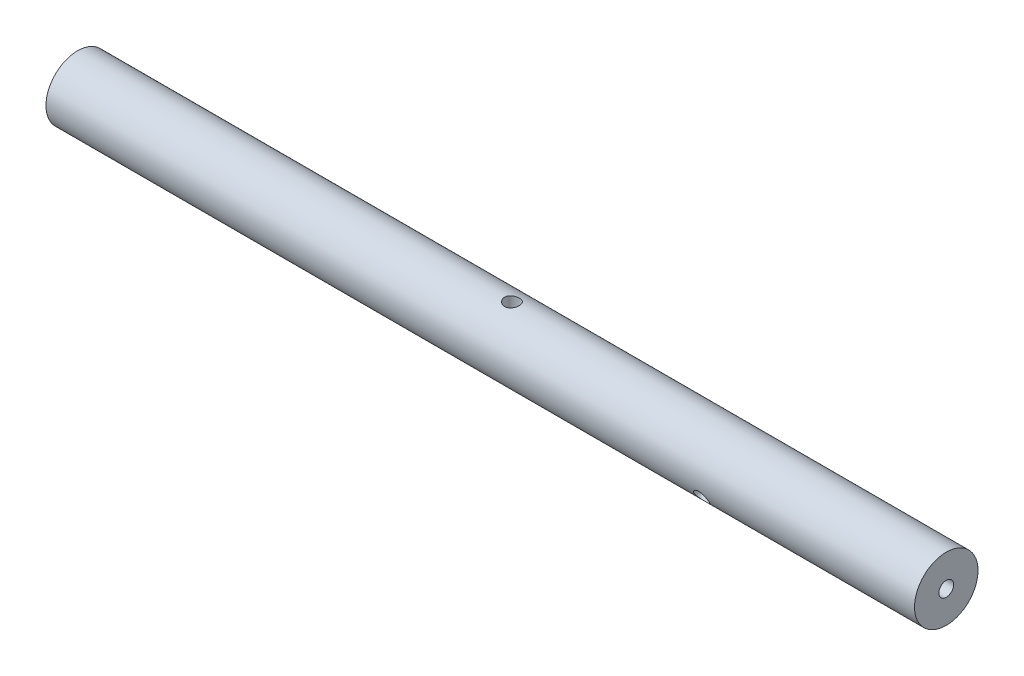
ISO-10303-21;
HEADER;
FILE_DESCRIPTION(('STEP AP214'),'2;1');
FILE_NAME('part.step','',(''),(''),'','','');
FILE_SCHEMA(('AUTOMOTIVE_DESIGN { 1 0 10303 214 1 1 1 1 }'));
ENDSEC;
DATA;
#1=APPLICATION_CONTEXT('core data for automotive mechanical design processes');
#2=APPLICATION_PROTOCOL_DEFINITION('international standard','automotive_design',2000,#1);
#3=PRODUCT_CONTEXT('',#1,'mechanical');
#4=PRODUCT('Part','Part','',(#3));
#5=PRODUCT_RELATED_PRODUCT_CATEGORY('part','',(#4));
#6=PRODUCT_DEFINITION_FORMATION('','',#4);
#7=PRODUCT_DEFINITION_CONTEXT('part definition',#1,'design');
#8=PRODUCT_DEFINITION('design','',#6,#7);
#9=PRODUCT_DEFINITION_SHAPE('','',#8);
#10=(LENGTH_UNIT() NAMED_UNIT(*) SI_UNIT(.MILLI.,.METRE.));
#11=(NAMED_UNIT(*) PLANE_ANGLE_UNIT() SI_UNIT($,.RADIAN.));
#12=(NAMED_UNIT(*) SI_UNIT($,.STERADIAN.) SOLID_ANGLE_UNIT());
#13=UNCERTAINTY_MEASURE_WITH_UNIT(LENGTH_MEASURE(1.E-05),#10,'distance_accuracy_value','');
#14=(GEOMETRIC_REPRESENTATION_CONTEXT(3) GLOBAL_UNCERTAINTY_ASSIGNED_CONTEXT((#13)) GLOBAL_UNIT_ASSIGNED_CONTEXT((#10,
#11,#12)) REPRESENTATION_CONTEXT('',''));
#15=CARTESIAN_POINT('',(0.,0.,0.));
#16=DIRECTION('',(0.,0.,1.));
#17=DIRECTION('',(1.,0.,0.));
#18=AXIS2_PLACEMENT_3D('',#15,#16,#17);
#19=CARTESIAN_POINT('',(304.,0.,0.));
#20=DIRECTION('',(-1.,0.,0.));
#21=DIRECTION('',(0.,0.,1.));
#22=AXIS2_PLACEMENT_3D('',#19,#20,#21);
#23=CYLINDRICAL_SURFACE('',#22,11.11);
#24=CARTESIAN_POINT('',(228.,-7.63729991491183,8.06868948526883));
#25=CARTESIAN_POINT('',(227.857206050793,-7.63729737460289,8.06869425359438));
#26=CARTESIAN_POINT('',(227.714358900543,-7.62842807157487,8.07711543123798));
#27=CARTESIAN_POINT('',(227.432743410383,-7.59310991494183,8.11032356623413));
#28=CARTESIAN_POINT('',(227.293977842589,-7.5666493891085,8.13512138983964));
#29=CARTESIAN_POINT('',(227.02463969806,-7.49668398538741,8.19963871520527));
#30=CARTESIAN_POINT('',(226.894057686016,-7.45319917142187,8.23934064951492));
#31=CARTESIAN_POINT('',(226.644387625805,-7.34995037812349,8.33157252437299));
#32=CARTESIAN_POINT('',(226.525299646415,-7.29018630138817,8.3841025416745));
#33=CARTESIAN_POINT('',(226.299733288068,-7.15421298381429,8.50043863853168));
#34=CARTESIAN_POINT('',(226.193505439678,-7.07773993387425,8.56442222611203));
#35=CARTESIAN_POINT('',(225.998874304842,-6.91029302069932,8.70008859999237));
#36=CARTESIAN_POINT('',(225.910472516096,-6.81931794019003,8.77177203243862));
#37=CARTESIAN_POINT('',(225.752997693792,-6.62340181090361,8.92064688780315));
#38=CARTESIAN_POINT('',(225.684167783989,-6.51830712369479,8.99789380984));
#39=CARTESIAN_POINT('',(225.569366717814,-6.29731756184636,9.15391502373882));
#40=CARTESIAN_POINT('',(225.523392663609,-6.18142405857377,9.23268912065779));
#41=CARTESIAN_POINT('',(225.456402364187,-5.94387518984704,9.38734108100553));
#42=CARTESIAN_POINT('',(225.434961479561,-5.82235697336378,9.46324551506538));
#43=CARTESIAN_POINT('',(225.416316297768,-5.57507988035985,9.6109997693072));
#44=CARTESIAN_POINT('',(225.419108890977,-5.44932154999062,9.68285010851701));
#45=CARTESIAN_POINT('',(225.448539631683,-5.19973778374768,9.81909703246836));
#46=CARTESIAN_POINT('',(225.474719813022,-5.07592148745279,9.8836100662894));
#47=CARTESIAN_POINT('',(225.549450160758,-4.83151230820271,10.0053606357911));
#48=CARTESIAN_POINT('',(225.598001418691,-4.71091958283654,10.0625978162928));
#49=CARTESIAN_POINT('',(225.716486302235,-4.47567048303367,10.1694303645679));
#50=CARTESIAN_POINT('',(225.786589080656,-4.36106977633113,10.2189604355522));
#51=CARTESIAN_POINT('',(225.946060058163,-4.14239966201978,10.3095418849164));
#52=CARTESIAN_POINT('',(226.03543118902,-4.03833186058697,10.3505919711634));
#53=CARTESIAN_POINT('',(226.233379729815,-3.84176097814323,10.4251762124415));
#54=CARTESIAN_POINT('',(226.342357790233,-3.74958566957661,10.4585119170313));
#55=CARTESIAN_POINT('',(226.575128695024,-3.58296701579384,10.5167609328243));
#56=CARTESIAN_POINT('',(226.69892205105,-3.50852428324596,10.5416739530326));
#57=CARTESIAN_POINT('',(226.958483247955,-3.37996150165802,10.5835991533192));
#58=CARTESIAN_POINT('',(227.094293584359,-3.32591744799275,10.6005818435449));
#59=CARTESIAN_POINT('',(227.373634417675,-3.2408183169185,10.6269093281547));
#60=CARTESIAN_POINT('',(227.517163510715,-3.20975907414459,10.6362555064786));
#61=CARTESIAN_POINT('',(227.804345387817,-3.17244727769871,10.6474434699306));
#62=CARTESIAN_POINT('',(227.94792006057,-3.165642901288,10.6494522157317));
#63=CARTESIAN_POINT('',(228.234167969219,-3.17560434049653,10.6464859768584));
#64=CARTESIAN_POINT('',(228.376841274749,-3.19236831242531,10.6415115384603));
#65=CARTESIAN_POINT('',(228.655228426144,-3.24833275798181,10.6245593336454));
#66=CARTESIAN_POINT('',(228.791010719891,-3.28722359193175,10.6126781699347));
#67=CARTESIAN_POINT('',(229.054008553654,-3.38561945533486,10.5816976332888));
#68=CARTESIAN_POINT('',(229.181223188372,-3.4451266591379,10.5625974989698));
#69=CARTESIAN_POINT('',(229.425882855137,-3.58369969236734,10.5163968078337));
#70=CARTESIAN_POINT('',(229.543122575351,-3.6630838791152,10.4891644815366));
#71=CARTESIAN_POINT('',(229.762322672498,-3.83803931842112,10.4264170493616));
#72=CARTESIAN_POINT('',(229.864280894622,-3.93361284976298,10.3909007771843));
#73=CARTESIAN_POINT('',(230.052242066214,-4.13994842080595,10.3104521451756));
#74=CARTESIAN_POINT('',(230.137859917599,-4.25099006329087,10.2653357281687));
#75=CARTESIAN_POINT('',(230.287938399714,-4.48295470256306,10.1661744664912));
#76=CARTESIAN_POINT('',(230.35240007783,-4.60387720980478,10.1121300640206));
#77=CARTESIAN_POINT('',(230.457819861664,-4.85080357346019,9.99601287383305));
#78=CARTESIAN_POINT('',(230.498936619729,-4.97676674668828,9.93399787918759));
#79=CARTESIAN_POINT('',(230.556987884387,-5.23049884385673,9.80277311236298));
#80=CARTESIAN_POINT('',(230.573926379692,-5.35826746643718,9.73356452893909));
#81=CARTESIAN_POINT('',(230.582942058634,-5.60865024331557,9.59142259008584));
#82=CARTESIAN_POINT('',(230.575591327805,-5.73131506466755,9.51861417610653));
#83=CARTESIAN_POINT('',(230.537529598267,-5.97110343021756,9.3700544209964));
#84=CARTESIAN_POINT('',(230.506819127578,-6.08822709960335,9.29430314642227));
#85=CARTESIAN_POINT('',(230.423198051676,-6.31347141833531,9.14278648371898));
#86=CARTESIAN_POINT('',(230.37037796021,-6.42162664447853,9.06702239804286));
#87=CARTESIAN_POINT('',(230.244121936876,-6.62706205247653,8.91797477457922));
#88=CARTESIAN_POINT('',(230.170683740723,-6.724341038258,8.84469151022727));
#89=CARTESIAN_POINT('',(230.003460819088,-6.90805108840274,8.7019973938647));
#90=CARTESIAN_POINT('',(229.909279510885,-6.99420998120042,8.63270086261733));
#91=CARTESIAN_POINT('',(229.704031497188,-7.15167821170303,8.50270830221399));
#92=CARTESIAN_POINT('',(229.592960651364,-7.22298389808235,8.44201438898656));
#93=CARTESIAN_POINT('',(229.355014841942,-7.35049272663532,8.33124353433473));
#94=CARTESIAN_POINT('',(229.227921633536,-7.4064446961468,8.28134570306007));
#95=CARTESIAN_POINT('',(228.962869847239,-7.50072195915349,8.19605646654894));
#96=CARTESIAN_POINT('',(228.824920043494,-7.53906131898824,8.16065348744158));
#97=CARTESIAN_POINT('',(228.572482223884,-7.59117294929293,8.11216106082328));
#98=CARTESIAN_POINT('',(228.459301323799,-7.60844916361104,8.09591574680687));
#99=CARTESIAN_POINT('',(228.230758439936,-7.63151331568119,8.0741783666477));
#100=CARTESIAN_POINT('',(228.115396592235,-7.63730196782091,8.0686856318246));
#101=CARTESIAN_POINT('',(228.,-7.63729991491183,8.06868948526883));
#102=B_SPLINE_CURVE_WITH_KNOTS('',3,(#24,#25,#26,#27,#28,#29,#30,#31,#32,#33,#34,#35,#36,#37,
#38,#39,#40,#41,#42,#43,#44,#45,#46,#47,#48,#49,#50,#51,#52,#53,#54,#55,#56,#57,#58,#59,#60,#61,
#62,#63,#64,#65,#66,#67,#68,#69,#70,#71,#72,#73,#74,#75,#76,#77,#78,#79,#80,#81,#82,#83,#84,#85,
#86,#87,#88,#89,#90,#91,#92,#93,#94,#95,#96,#97,#98,#99,#100,#101),.UNSPECIFIED.,.T.,.F.,(4,2,2,
2,2,2,2,2,2,2,2,2,2,2,2,2,2,2,2,2,2,2,2,2,2,2,2,2,2,2,2,2,2,2,2,2,2,2,4),(0.,0.427958589243742,
0.856201423798316,1.28394106610051,1.71168326772106,2.14674201170975,2.58183729299628,
3.02212224474731,3.46235135968424,3.89483955494707,4.32727225443571,4.75141845725171,
5.17558535730033,5.60317032170868,6.03082039115803,6.46848201566221,6.90615875937449,
7.34545034265557,7.78466229690882,8.21381559615048,8.64293532571614,9.06619273657193,
9.48949480077892,9.92006687005439,10.3506995963391,10.7904834385017,11.2302455048545,
11.666982027164,12.1036464922691,12.5301001626726,12.9565441938703,13.3812592371416,
13.8060209409947,14.2397442886435,14.6735741318884,15.1141271358033,15.5543276770175,
15.9001969139619,16.2460446413408),.UNSPECIFIED.);
#103=CARTESIAN_POINT('',(228.,-7.63729991491183,8.06868948526883));
#104=VERTEX_POINT('',#103);
#105=EDGE_CURVE('E11',#104,#104,#102,.T.);
#106=ORIENTED_EDGE('',*,*,#105,.T.);
#107=EDGE_LOOP('',(#106));
#108=FACE_BOUND('',#107,.T.);
#109=CARTESIAN_POINT('',(76.,-3.16904011203537,-10.6484404852688));
#110=CARTESIAN_POINT('',(75.8572060507933,-3.1690455116809,-10.6484406694595));
#111=CARTESIAN_POINT('',(75.7143589005434,-3.18077311696405,-10.6449702165451));
#112=CARTESIAN_POINT('',(75.4327434103829,-3.22719128379955,-10.6309878631842));
#113=CARTESIAN_POINT('',(75.2939778425891,-3.26189709191716,-10.6204712874178));
#114=CARTESIAN_POINT('',(75.0246396980597,-3.35275343652855,-10.5921381330921));
#115=CARTESIAN_POINT('',(74.8940576860156,-3.40887872720286,-10.5743301466739));
#116=CARTESIAN_POINT('',(74.6443876258045,-3.54037827051779,-10.5310300061965));
#117=CARTESIAN_POINT('',(74.5252996464148,-3.6157526383298,-10.5055378061607));
#118=CARTESIAN_POINT('',(74.2997332880682,-3.78448931237219,-10.4459495073334));
#119=CARTESIAN_POINT('',(74.1935054396783,-3.87813724961207,-10.4117136971707));
#120=CARTESIAN_POINT('',(73.9988743048423,-4.07935123241923,-10.3345336035161));
#121=CARTESIAN_POINT('',(73.9104725160956,-4.1869184462028,-10.2915885889068));
#122=CARTESIAN_POINT('',(73.7529976937924,-4.41380591757643,-10.1963576716159));
#123=CARTESIAN_POINT('',(73.6841677839891,-4.53325105802891,-10.1439664637087));
#124=CARTESIAN_POINT('',(73.5693667178144,-4.77886417371878,-10.0305944961262));
#125=CARTESIAN_POINT('',(73.5233926636093,-4.90503129444709,-9.96961482661803));
#126=CARTESIAN_POINT('',(73.4564023641869,-5.15773825521666,-9.8412174518343));
#127=CARTESIAN_POINT('',(73.4349614795613,-5.284232531614,-9.77393180636714));
#128=CARTESIAN_POINT('',(73.4163162977682,-5.5358300158066,-9.63366068917267));
#129=CARTESIAN_POINT('',(73.4191088909771,-5.66093340001743,-9.56067594994031));
#130=CARTESIAN_POINT('',(73.4485396316833,-5.90371858046826,-9.4126535299774));
#131=CARTESIAN_POINT('',(73.4747198130217,-6.02149665477992,-9.33768198889405));
#132=CARTESIAN_POINT('',(73.549450160758,-6.24914033051869,-9.18689271549623));
#133=CARTESIAN_POINT('',(73.5980014186907,-6.35900554555722,-9.11107494206836));
#134=CARTESIAN_POINT('',(73.7164863022345,-6.5691497962159,-8.9607595195592));
#135=CARTESIAN_POINT('',(73.7865890806561,-6.66934444929085,-8.88627743175531));
#136=CARTESIAN_POINT('',(73.9460600581635,-6.85712534270754,-8.74219428239535));
#137=CARTESIAN_POINT('',(74.03543118902,-6.94470966094133,-8.672593965762));
#138=CARTESIAN_POINT('',(74.2333797298153,-7.10758694983208,-8.53965070856048));
#139=CARTESIAN_POINT('',(74.3423577902326,-7.1825441711432,-8.47649240203501));
#140=CARTESIAN_POINT('',(74.5751286950235,-7.31629862545677,-8.36132092301127));
#141=CARTESIAN_POINT('',(74.6989220510502,-7.37509530011606,-8.3093081356018));
#142=CARTESIAN_POINT('',(74.9584832479553,-7.47568497941696,-8.21893210090876));
#143=CARTESIAN_POINT('',(75.0942935843588,-7.51741444740963,-8.18061992262399));
#144=CARTESIAN_POINT('',(75.3736344176745,-7.5827642834366,-8.12008565557861));
#145=CARTESIAN_POINT('',(75.5171635107147,-7.60638793268036,-8.09786065147606));
#146=CARTESIAN_POINT('',(75.8043453878175,-7.63473289146931,-8.07114166961908));
#147=CARTESIAN_POINT('',(75.9479200605705,-7.63987470456819,-8.06625327969106));
#148=CARTESIAN_POINT('',(76.2341679692192,-7.63232514674598,-8.07339701966726));
#149=CARTESIAN_POINT('',(76.3768412747495,-7.6196351707593,-8.08542782602688));
#150=CARTESIAN_POINT('',(76.6552284261438,-7.57697190796112,-8.12541835518003));
#151=CARTESIAN_POINT('',(76.7910107198912,-7.54723710138624,-8.15315822349973));
#152=CARTESIAN_POINT('',(77.054008553654,-7.47120923792642,-8.22288127251115));
#153=CARTESIAN_POINT('',(77.1812231883717,-7.42491443448897,-8.26486595555329));
#154=CARTESIAN_POINT('',(77.4258828551373,-7.31561694567799,-8.36177337704141));
#155=CARTESIAN_POINT('',(77.5431225753507,-7.25234096592657,-8.41690593627526));
#156=CARTESIAN_POINT('',(77.762322672498,-7.1105223759878,-8.53704807515694));
#157=CARTESIAN_POINT('',(77.8642808946216,-7.03197761636368,-8.60205904513976));
#158=CARTESIAN_POINT('',(78.0522420662138,-6.85913927182295,-8.740526575363));
#159=CARTESIAN_POINT('',(78.1378599175985,-6.76454648732477,-8.81413325012943));
#160=CARTESIAN_POINT('',(78.2879383997138,-6.56268799600463,-8.96543988968008));
#161=CARTESIAN_POINT('',(78.3524000778301,-6.45542291691184,-9.0431396516054));
#162=CARTESIAN_POINT('',(78.4578198616638,-6.23139929856568,-9.19892556030135));
#163=CARTESIAN_POINT('',(78.4989366197287,-6.11471115117311,-9.27700537093543));
#164=CARTESIAN_POINT('',(78.5569878843866,-5.87420112091309,-9.43113142942651));
#165=CARTESIAN_POINT('',(78.5739263796925,-5.75038041821785,-9.50717801067578));
#166=CARTESIAN_POINT('',(78.582942058634,-5.50209049978856,-9.65294488669593));
#167=CARTESIAN_POINT('',(78.575591327805,-5.37770415299724,-9.72277153114778));
#168=CARTESIAN_POINT('',(78.5375295982668,-5.12915344831687,-9.85615446969097));
#169=CARTESIAN_POINT('',(78.5068191275776,-5.00498908547372,-9.91971090547645));
#170=CARTESIAN_POINT('',(78.4231980516757,-4.76114964711006,-10.0390198762048));
#171=CARTESIAN_POINT('',(78.3703779602095,-4.64145841114844,-10.0948030067588));
#172=CARTESIAN_POINT('',(78.244121936876,-4.40966167885623,-10.1981914771901));
#173=CARTESIAN_POINT('',(78.1706837407226,-4.29755701736445,-10.2457959179553));
#174=CARTESIAN_POINT('',(78.0034608190883,-4.08212526255152,-10.3335464301298));
#175=CARTESIAN_POINT('',(77.9092795108853,-3.97903325969831,-10.3735139544309));
#176=CARTESIAN_POINT('',(77.704031497188,-3.78772228483473,-10.4448891621335));
#177=CARTESIAN_POINT('',(77.5929606513638,-3.69950697093504,-10.4762947413585));
#178=CARTESIAN_POINT('',(77.3550148419421,-3.53982218253116,-10.5313351987663));
#179=CARTESIAN_POINT('',(77.2279216335358,-3.46863340829782,-10.5548421101176));
#180=CARTESIAN_POINT('',(76.9628698472392,-3.34763213130646,-10.5938439966251));
#181=CARTESIAN_POINT('',(76.8249200434941,-3.29780257211245,-10.6093453666532));
#182=CARTESIAN_POINT('',(76.5724822238841,-3.22975108361751,-10.6302291490205));
#183=CARTESIAN_POINT('',(76.4593013237994,-3.20704412182779,-10.637068132493));
#184=CARTESIAN_POINT('',(76.2307584399355,-3.17668692236315,-10.6461735840229));
#185=CARTESIAN_POINT('',(76.1153965922354,-3.16903574840024,-10.6484403364181));
#186=CARTESIAN_POINT('',(76.,-3.16904011203537,-10.6484404852688));
#187=B_SPLINE_CURVE_WITH_KNOTS('',3,(#109,#110,#111,#112,#113,#114,#115,#116,#117,#118,#119,
#120,#121,#122,#123,#124,#125,#126,#127,#128,#129,#130,#131,#132,#133,#134,#135,#136,#137,#138,
#139,#140,#141,#142,#143,#144,#145,#146,#147,#148,#149,#150,#151,#152,#153,#154,#155,#156,#157,
#158,#159,#160,#161,#162,#163,#164,#165,#166,#167,#168,#169,#170,#171,#172,#173,#174,#175,#176,
#177,#178,#179,#180,#181,#182,#183,#184,#185,#186),.UNSPECIFIED.,.T.,.F.,(4,2,2,2,2,2,2,2,2,2,2,
2,2,2,2,2,2,2,2,2,2,2,2,2,2,2,2,2,2,2,2,2,2,2,2,2,2,2,4),(0.,0.427958589243783,
0.856201423798331,1.2839410661005,1.71168326772106,2.14674201170974,2.58183729299632,
3.02212224474733,3.46235135968427,3.89483955494709,4.32727225443574,4.75141845725173,
5.17558535730036,5.60317032170872,6.03082039115806,6.46848201566223,6.90615875937452,
7.3454503426556,7.78466229690887,8.21381559615049,8.64293532571611,9.06619273657193,
9.48949480077898,9.92006687005444,10.3506995963391,10.7904834385018,11.2302455048546,
11.6669820271641,12.1036464922691,12.5301001626727,12.9565441938703,13.3812592371416,
13.8060209409948,14.2397442886435,14.6735741318884,15.1141271358033,15.5543276770176,
15.9001969139619,16.2460446413408),.UNSPECIFIED.);
#188=CARTESIAN_POINT('',(76.,-3.16904011203537,-10.6484404852688));
#189=VERTEX_POINT('',#188);
#190=EDGE_CURVE('E50',#189,#189,#187,.T.);
#191=ORIENTED_EDGE('',*,*,#190,.T.);
#192=EDGE_LOOP('',(#191));
#193=FACE_BOUND('',#192,.T.);
#194=CARTESIAN_POINT('',(152.,10.8063400269471,2.57975099999999));
#195=CARTESIAN_POINT('',(151.857206050793,10.8063428862837,2.57974641586514));
#196=CARTESIAN_POINT('',(151.714358900543,10.8092011885388,2.56785478530721));
#197=CARTESIAN_POINT('',(151.432743410383,10.8203011987413,2.52066429695008));
#198=CARTESIAN_POINT('',(151.293977842589,10.8285464810255,2.48534989757816));
#199=CARTESIAN_POINT('',(151.02463969806,10.8494374219159,2.39249941788686));
#200=CARTESIAN_POINT('',(150.894057686016,10.8620778986246,2.33498949715904));
#201=CARTESIAN_POINT('',(150.644387625805,10.8903286486412,2.19945748182352));
#202=CARTESIAN_POINT('',(150.525299646415,10.9059389397179,2.12143526448626));
#203=CARTESIAN_POINT('',(150.299733288068,10.9387022961864,1.94551086880183));
#204=CARTESIAN_POINT('',(150.193505439678,10.9558771834862,1.8472914710587));
#205=CARTESIAN_POINT('',(149.998874304842,10.9896442531184,1.63444500352376));
#206=CARTESIAN_POINT('',(149.910472516096,11.0062363863927,1.51981655646825));
#207=CARTESIAN_POINT('',(149.752997693792,11.0372077284799,1.27571078381283));
#208=CARTESIAN_POINT('',(149.684167783989,11.0515581817236,1.14607265386879));
#209=CARTESIAN_POINT('',(149.569366717814,11.076181735565,0.876679472387452));
#210=CARTESIAN_POINT('',(149.523392663609,11.0864553530207,0.736925705960319));
#211=CARTESIAN_POINT('',(149.456402364187,11.1016134450636,0.453876370828853));
#212=CARTESIAN_POINT('',(149.434961479561,11.1065895049777,0.310686291301847));
#213=CARTESIAN_POINT('',(149.416316297768,11.1109098961663,0.0226609198655676));
#214=CARTESIAN_POINT('',(149.419108890977,11.1102549500079,-0.122174158576603));
#215=CARTESIAN_POINT('',(149.448539631683,11.1034563642158,-0.406443502490865));
#216=CARTESIAN_POINT('',(149.474719813022,11.0974181422326,-0.545928077395259));
#217=CARTESIAN_POINT('',(149.549450160758,11.0806526387213,-0.818467920294805));
#218=CARTESIAN_POINT('',(149.598001418691,11.0699251283937,-0.951522874224346));
#219=CARTESIAN_POINT('',(149.716486302235,11.0448202792495,-1.20867084500859));
#220=CARTESIAN_POINT('',(149.786589080656,11.0304142256219,-1.33268300379681));
#221=CARTESIAN_POINT('',(149.946060058163,10.9995250047272,-1.56734760252098));
#222=CARTESIAN_POINT('',(150.03543118902,10.9830415215282,-1.67799800540126));
#223=CARTESIAN_POINT('',(150.233379729815,10.9493479279752,-1.88552550388095));
#224=CARTESIAN_POINT('',(150.342357790233,10.9321298407197,-1.9820195149962));
#225=CARTESIAN_POINT('',(150.575128695024,10.8992656412505,-2.15544000981295));
#226=CARTESIAN_POINT('',(150.69892205105,10.8836195833619,-2.23236581743068));
#227=CARTESIAN_POINT('',(150.958483247955,10.8556464810749,-2.36466705241032));
#228=CARTESIAN_POINT('',(151.094293584359,10.8433318954023,-2.41996192092077));
#229=CARTESIAN_POINT('',(151.373634417675,10.823582600355,-2.50682367257596));
#230=CARTESIAN_POINT('',(151.517163510715,10.8161470068249,-2.53839485500243));
#231=CARTESIAN_POINT('',(151.804345387817,10.807180169168,-2.57630180031138));
#232=CARTESIAN_POINT('',(151.94792006057,10.8055176058561,-2.58319893604053));
#233=CARTESIAN_POINT('',(152.234167969219,10.8079294872424,-2.57308895719106));
#234=CARTESIAN_POINT('',(152.376841274749,10.8120034831845,-2.55608371243338));
#235=CARTESIAN_POINT('',(152.655228426144,10.8253046659429,-2.49914097846524));
#236=CARTESIAN_POINT('',(152.791010719891,10.8344606933179,-2.45951994643493));
#237=CARTESIAN_POINT('',(153.054008553654,10.8568286932612,-2.35881636077755));
#238=CARTESIAN_POINT('',(153.181223188372,10.8700410936268,-2.29773154341646));
#239=CARTESIAN_POINT('',(153.425882855137,10.8993166380453,-2.15462343079226));
#240=CARTESIAN_POINT('',(153.543122575351,10.9154248450417,-2.07225854526125));
#241=CARTESIAN_POINT('',(153.762322672498,10.9485616944089,-1.88936897420455));
#242=CARTESIAN_POINT('',(153.864280894622,10.9655904661266,-1.78884173204451));
#243=CARTESIAN_POINT('',(154.052242066214,10.9990876926289,-1.56992556981257));
#244=CARTESIAN_POINT('',(154.137859917599,11.0155365506156,-1.45120247803922));
#245=CARTESIAN_POINT('',(154.287938399714,11.0456426985676,-1.20073457681106));
#246=CARTESIAN_POINT('',(154.35240007783,11.0593001267166,-1.0689904124151));
#247=CARTESIAN_POINT('',(154.457819861664,11.0822028720258,-0.79708731353164));
#248=CARTESIAN_POINT('',(154.498936619729,11.0914778978613,-0.65699250825209));
#249=CARTESIAN_POINT('',(154.556987884387,11.1046999647698,-0.3716416829364));
#250=CARTESIAN_POINT('',(154.573926379692,11.108647884655,-0.226386518263246));
#251=CARTESIAN_POINT('',(154.582942058634,11.1107407431041,0.061522296610162));
#252=CARTESIAN_POINT('',(154.575591327805,11.1090192176647,0.204157355041313));
#253=CARTESIAN_POINT('',(154.537529598267,11.1002568785344,0.486100048694628));
#254=CARTESIAN_POINT('',(154.506819127578,11.093216185077,0.625407759054241));
#255=CARTESIAN_POINT('',(154.423198051676,11.0746210654453,0.89623339248588));
#256=CARTESIAN_POINT('',(154.37037796021,11.0630850556269,1.02778060871602));
#257=CARTESIAN_POINT('',(154.244121936876,11.0367237313327,1.28021670261093));
#258=CARTESIAN_POINT('',(154.170683740723,11.0218980556224,1.40110440772805));
#259=CARTESIAN_POINT('',(154.003460819088,10.9901763509542,1.63154903626519));
#260=CARTESIAN_POINT('',(153.909279510885,10.9732432408986,1.7408130918136));
#261=CARTESIAN_POINT('',(153.704031497188,10.9394004965377,1.94218085991952));
#262=CARTESIAN_POINT('',(153.592960651364,10.9224908690173,2.03428035237201));
#263=CARTESIAN_POINT('',(153.355014841942,10.8903149091664,2.20009166443159));
#264=CARTESIAN_POINT('',(153.227921633536,10.8750781044445,2.27349640705763));
#265=CARTESIAN_POINT('',(152.962869847239,10.8483540904598,2.39778753007626));
#266=CARTESIAN_POINT('',(152.824920043494,10.8368638911006,2.44869187921167));
#267=CARTESIAN_POINT('',(152.572482223884,10.8209240329103,2.5180680881973));
#268=CARTESIAN_POINT('',(152.459301323799,10.8154932854387,2.54115238568622));
#269=CARTESIAN_POINT('',(152.230758439936,10.8082002380442,2.5719952173753));
#270=CARTESIAN_POINT('',(152.115396592235,10.806337716221,2.57975470459352));
#271=CARTESIAN_POINT('',(152.,10.8063400269471,2.57975099999999));
#272=B_SPLINE_CURVE_WITH_KNOTS('',3,(#194,#195,#196,#197,#198,#199,#200,#201,#202,#203,#204,
#205,#206,#207,#208,#209,#210,#211,#212,#213,#214,#215,#216,#217,#218,#219,#220,#221,#222,#223,
#224,#225,#226,#227,#228,#229,#230,#231,#232,#233,#234,#235,#236,#237,#238,#239,#240,#241,#242,
#243,#244,#245,#246,#247,#248,#249,#250,#251,#252,#253,#254,#255,#256,#257,#258,#259,#260,#261,
#262,#263,#264,#265,#266,#267,#268,#269,#270,#271),.UNSPECIFIED.,.T.,.F.,(4,2,2,2,2,2,2,2,2,2,2,
2,2,2,2,2,2,2,2,2,2,2,2,2,2,2,2,2,2,2,2,2,2,2,2,2,2,2,4),(0.,0.42795858924377,0.856201423798316,
1.28394106610051,1.71168326772106,2.14674201170975,2.58183729299628,3.02212224474731,
3.46235135968424,3.89483955494707,4.32727225443571,4.75141845725171,5.17558535730033,
5.60317032170868,6.03082039115803,6.46848201566221,6.90615875937449,7.34545034265557,
7.78466229690882,8.21381559615043,8.64293532571611,9.06619273657193,9.48949480077892,
9.92006687005439,10.3506995963391,10.7904834385017,11.2302455048545,11.666982027164,
12.103646492269,12.5301001626726,12.9565441938703,13.3812592371416,13.8060209409947,
14.2397442886435,14.6735741318884,15.1141271358033,15.5543276770175,15.9001969139619,
16.2460446413408),.UNSPECIFIED.);
#273=CARTESIAN_POINT('',(152.,10.8063400269471,2.57975099999999));
#274=VERTEX_POINT('',#273);
#275=EDGE_CURVE('E100',#274,#274,#272,.T.);
#276=ORIENTED_EDGE('',*,*,#275,.T.);
#277=EDGE_LOOP('',(#276));
#278=FACE_BOUND('',#277,.T.);
#279=CARTESIAN_POINT('',(304.,0.,0.));
#280=DIRECTION('',(1.,0.,0.));
#281=DIRECTION('',(0.,0.,-1.));
#282=AXIS2_PLACEMENT_3D('',#279,#280,#281);
#283=CIRCLE('',#282,11.11);
#284=CARTESIAN_POINT('',(304.,0.,-11.11));
#285=VERTEX_POINT('',#284);
#286=EDGE_CURVE('E97',#285,#285,#283,.T.);
#287=ORIENTED_EDGE('',*,*,#286,.F.);
#288=EDGE_LOOP('',(#287));
#289=FACE_BOUND('',#288,.T.);
#290=CARTESIAN_POINT('',(0.,0.,0.));
#291=DIRECTION('',(1.,0.,0.));
#292=DIRECTION('',(0.,0.,-1.));
#293=AXIS2_PLACEMENT_3D('',#290,#291,#292);
#294=CIRCLE('',#293,11.11);
#295=CARTESIAN_POINT('',(0.,0.,-11.11));
#296=VERTEX_POINT('',#295);
#297=EDGE_CURVE('E96',#296,#296,#294,.T.);
#298=ORIENTED_EDGE('',*,*,#297,.T.);
#299=EDGE_LOOP('',(#298));
#300=FACE_BOUND('',#299,.T.);
#301=ADVANCED_FACE('F39',(#108,#193,#278,#289,#300),#23,.T.);
#302=CARTESIAN_POINT('',(304.,0.,0.));
#303=DIRECTION('',(1.,0.,0.));
#304=DIRECTION('',(0.,0.,-1.));
#305=AXIS2_PLACEMENT_3D('',#302,#303,#304);
#306=PLANE('',#305);
#307=CARTESIAN_POINT('',(304.,0.,0.));
#308=DIRECTION('',(1.,0.,0.));
#309=DIRECTION('',(0.,0.,-1.));
#310=AXIS2_PLACEMENT_3D('',#307,#308,#309);
#311=CIRCLE('',#310,2.57975099999999);
#312=CARTESIAN_POINT('',(304.,0.,-2.57975099999999));
#313=VERTEX_POINT('',#312);
#314=EDGE_CURVE('E77',#313,#313,#311,.T.);
#315=ORIENTED_EDGE('',*,*,#314,.F.);
#316=EDGE_LOOP('',(#315));
#317=FACE_BOUND('',#316,.T.);
#318=ORIENTED_EDGE('',*,*,#286,.T.);
#319=EDGE_LOOP('',(#318));
#320=FACE_BOUND('',#319,.T.);
#321=ADVANCED_FACE('F129',(#317,#320),#306,.T.);
#322=CARTESIAN_POINT('',(0.,0.,0.));
#323=DIRECTION('',(1.,0.,0.));
#324=DIRECTION('',(0.,0.,-1.));
#325=AXIS2_PLACEMENT_3D('',#322,#323,#324);
#326=PLANE('',#325);
#327=CARTESIAN_POINT('',(0.,5.3,0.));
#328=DIRECTION('',(-1.,0.,0.));
#329=DIRECTION('',(0.,0.,1.));
#330=AXIS2_PLACEMENT_3D('',#327,#328,#329);
#331=CIRCLE('',#330,1.49999999999999);
#332=CARTESIAN_POINT('',(0.,5.3,1.49999999999999));
#333=VERTEX_POINT('',#332);
#334=EDGE_CURVE('E90',#333,#333,#331,.T.);
#335=ORIENTED_EDGE('',*,*,#334,.F.);
#336=EDGE_LOOP('',(#335));
#337=FACE_BOUND('',#336,.T.);
#338=ORIENTED_EDGE('',*,*,#297,.F.);
#339=EDGE_LOOP('',(#338));
#340=FACE_BOUND('',#339,.T.);
#341=ADVANCED_FACE('F128',(#337,#340),#326,.F.);
#342=CARTESIAN_POINT('',(11.,5.3,0.));
#343=DIRECTION('',(-1.,0.,0.));
#344=DIRECTION('',(0.,0.,1.));
#345=AXIS2_PLACEMENT_3D('',#342,#343,#344);
#346=CONICAL_SURFACE('',#345,1.5,1.02974425867665);
#347=CARTESIAN_POINT('',(11.9012909285413,5.3,0.));
#348=VERTEX_POINT('',#347);
#349=VERTEX_LOOP('',#348);
#350=FACE_BOUND('',#349,.T.);
#351=CARTESIAN_POINT('',(11.,5.3,0.));
#352=DIRECTION('',(-1.,0.,0.));
#353=DIRECTION('',(0.,0.,1.));
#354=AXIS2_PLACEMENT_3D('',#351,#352,#353);
#355=CIRCLE('',#354,1.5);
#356=CARTESIAN_POINT('',(11.,5.3,1.5));
#357=VERTEX_POINT('',#356);
#358=EDGE_CURVE('E93',#357,#357,#355,.T.);
#359=ORIENTED_EDGE('',*,*,#358,.T.);
#360=EDGE_LOOP('',(#359));
#361=FACE_BOUND('',#360,.T.);
#362=ADVANCED_FACE('F124',(#350,#361),#346,.F.);
#363=CARTESIAN_POINT('',(0.,5.3,0.));
#364=DIRECTION('',(-1.,0.,0.));
#365=DIRECTION('',(0.,0.,1.));
#366=AXIS2_PLACEMENT_3D('',#363,#364,#365);
#367=CYLINDRICAL_SURFACE('',#366,1.49999999999999);
#368=ORIENTED_EDGE('',*,*,#358,.F.);
#369=EDGE_LOOP('',(#368));
#370=FACE_BOUND('',#369,.T.);
#371=ORIENTED_EDGE('',*,*,#334,.T.);
#372=EDGE_LOOP('',(#371));
#373=FACE_BOUND('',#372,.T.);
#374=ADVANCED_FACE('F116',(#370,#373),#367,.F.);
#375=CARTESIAN_POINT('',(152.,11.11,0.));
#376=DIRECTION('',(0.,1.,0.));
#377=DIRECTION('',(0.,0.,1.));
#378=AXIS2_PLACEMENT_3D('',#375,#376,#377);
#379=CYLINDRICAL_SURFACE('',#378,2.57975099999999);
#380=CARTESIAN_POINT('',(152.,4.11,0.));
#381=DIRECTION('',(0.,1.,0.));
#382=DIRECTION('',(0.,0.,1.));
#383=AXIS2_PLACEMENT_3D('',#380,#381,#382);
#384=CIRCLE('',#383,2.57975099999999);
#385=CARTESIAN_POINT('',(152.,4.11,2.57975099999999));
#386=VERTEX_POINT('',#385);
#387=EDGE_CURVE('E87',#386,#386,#384,.T.);
#388=ORIENTED_EDGE('',*,*,#387,.F.);
#389=EDGE_LOOP('',(#388));
#390=FACE_BOUND('',#389,.T.);
#391=ORIENTED_EDGE('',*,*,#275,.F.);
#392=EDGE_LOOP('',(#391));
#393=FACE_BOUND('',#392,.T.);
#394=ADVANCED_FACE('F110',(#390,#393),#379,.F.);
#395=CARTESIAN_POINT('',(152.,4.11,0.));
#396=DIRECTION('',(0.,1.,0.));
#397=DIRECTION('',(0.,0.,1.));
#398=AXIS2_PLACEMENT_3D('',#395,#396,#397);
#399=CONICAL_SURFACE('',#398,2.57975099999999,1.02974425867665);
#400=CARTESIAN_POINT('',(152.,2.55992921720303,0.));
#401=VERTEX_POINT('',#400);
#402=VERTEX_LOOP('',#401);
#403=FACE_BOUND('',#402,.T.);
#404=ORIENTED_EDGE('',*,*,#387,.T.);
#405=EDGE_LOOP('',(#404));
#406=FACE_BOUND('',#405,.T.);
#407=ADVANCED_FACE('F115',(#403,#406),#399,.F.);
#408=CARTESIAN_POINT('',(76.,-5.55500000000011,-9.62154223604506));
#409=DIRECTION('',(0.,-0.50000000000001,-0.866025403784433));
#410=DIRECTION('',(0.,0.866025403784433,-0.50000000000001));
#411=AXIS2_PLACEMENT_3D('',#408,#409,#410);
#412=CYLINDRICAL_SURFACE('',#411,2.57975099999999);
#413=CARTESIAN_POINT('',(76.,-2.05500000000004,-3.55936440955402));
#414=DIRECTION('',(0.,-0.50000000000001,-0.866025403784433));
#415=DIRECTION('',(0.,0.866025403784433,-0.50000000000001));
#416=AXIS2_PLACEMENT_3D('',#413,#414,#415);
#417=CIRCLE('',#416,2.57975099999999);
#418=CARTESIAN_POINT('',(76.,0.179129901438243,-4.84923990955405));
#419=VERTEX_POINT('',#418);
#420=EDGE_CURVE('E80',#419,#419,#417,.T.);
#421=ORIENTED_EDGE('',*,*,#420,.F.);
#422=EDGE_LOOP('',(#421));
#423=FACE_BOUND('',#422,.T.);
#424=ORIENTED_EDGE('',*,*,#190,.F.);
#425=EDGE_LOOP('',(#424));
#426=FACE_BOUND('',#425,.T.);
#427=ADVANCED_FACE('F121',(#423,#426),#412,.F.);
#428=CARTESIAN_POINT('',(76.,-2.05500000000004,-3.55936440955402));
#429=DIRECTION('',(0.,-0.50000000000001,-0.866025403784433));
#430=DIRECTION('',(0.,0.866025403784433,-0.50000000000001));
#431=AXIS2_PLACEMENT_3D('',#428,#429,#430);
#432=CONICAL_SURFACE('',#431,2.57975099999999,1.02974425867665);
#433=CARTESIAN_POINT('',(76.,-1.27996460860154,-2.21696373398783));
#434=VERTEX_POINT('',#433);
#435=VERTEX_LOOP('',#434);
#436=FACE_BOUND('',#435,.T.);
#437=ORIENTED_EDGE('',*,*,#420,.T.);
#438=EDGE_LOOP('',(#437));
#439=FACE_BOUND('',#438,.T.);
#440=ADVANCED_FACE('F118',(#436,#439),#432,.F.);
#441=CARTESIAN_POINT('',(228.,-5.55499999999998,9.62154223604513));
#442=DIRECTION('',(0.,-0.499999999999998,0.86602540378444));
#443=DIRECTION('',(0.,-0.86602540378444,-0.499999999999998));
#444=AXIS2_PLACEMENT_3D('',#441,#442,#443);
#445=CYLINDRICAL_SURFACE('',#444,2.57975099999999);
#446=CARTESIAN_POINT('',(228.,-2.05499999999999,3.55936440955405));
#447=DIRECTION('',(0.,-0.499999999999998,0.86602540378444));
#448=DIRECTION('',(0.,-0.86602540378444,-0.499999999999998));
#449=AXIS2_PLACEMENT_3D('',#446,#447,#448);
#450=CIRCLE('',#449,2.57975099999999);
#451=CARTESIAN_POINT('',(228.,-4.2891299014383,2.26948890955406));
#452=VERTEX_POINT('',#451);
#453=EDGE_CURVE('E76',#452,#452,#450,.T.);
#454=ORIENTED_EDGE('',*,*,#453,.F.);
#455=EDGE_LOOP('',(#454));
#456=FACE_BOUND('',#455,.T.);
#457=ORIENTED_EDGE('',*,*,#105,.F.);
#458=EDGE_LOOP('',(#457));
#459=FACE_BOUND('',#458,.T.);
#460=ADVANCED_FACE('F160',(#456,#459),#445,.F.);
#461=CARTESIAN_POINT('',(228.,-2.05499999999999,3.55936440955405));
#462=DIRECTION('',(0.,-0.499999999999998,0.86602540378444));
#463=DIRECTION('',(0.,-0.86602540378444,-0.499999999999998));
#464=AXIS2_PLACEMENT_3D('',#461,#462,#463);
#465=CONICAL_SURFACE('',#464,2.57975099999999,1.02974425867665);
#466=CARTESIAN_POINT('',(228.,-1.27996460860151,2.21696373398784));
#467=VERTEX_POINT('',#466);
#468=VERTEX_LOOP('',#467);
#469=FACE_BOUND('',#468,.T.);
#470=ORIENTED_EDGE('',*,*,#453,.T.);
#471=EDGE_LOOP('',(#470));
#472=FACE_BOUND('',#471,.T.);
#473=ADVANCED_FACE('F70',(#469,#472),#465,.F.);
#474=CARTESIAN_POINT('',(297.,0.,0.));
#475=DIRECTION('',(1.,0.,0.));
#476=DIRECTION('',(0.,0.,-1.));
#477=AXIS2_PLACEMENT_3D('',#474,#475,#476);
#478=CONICAL_SURFACE('',#477,2.57975099999999,1.02974425867666);
#479=CARTESIAN_POINT('',(295.449929217203,0.,0.));
#480=VERTEX_POINT('',#479);
#481=VERTEX_LOOP('',#480);
#482=FACE_BOUND('',#481,.T.);
#483=CARTESIAN_POINT('',(297.,0.,0.));
#484=DIRECTION('',(1.,0.,0.));
#485=DIRECTION('',(0.,0.,-1.));
#486=AXIS2_PLACEMENT_3D('',#483,#484,#485);
#487=CIRCLE('',#486,2.57975099999999);
#488=CARTESIAN_POINT('',(297.,0.,-2.57975099999999));
#489=VERTEX_POINT('',#488);
#490=EDGE_CURVE('E74',#489,#489,#487,.T.);
#491=ORIENTED_EDGE('',*,*,#490,.T.);
#492=EDGE_LOOP('',(#491));
#493=FACE_BOUND('',#492,.T.);
#494=ADVANCED_FACE('F66',(#482,#493),#478,.F.);
#495=CARTESIAN_POINT('',(304.,0.,0.));
#496=DIRECTION('',(1.,0.,0.));
#497=DIRECTION('',(0.,0.,-1.));
#498=AXIS2_PLACEMENT_3D('',#495,#496,#497);
#499=CYLINDRICAL_SURFACE('',#498,2.57975099999999);
#500=ORIENTED_EDGE('',*,*,#490,.F.);
#501=EDGE_LOOP('',(#500));
#502=FACE_BOUND('',#501,.T.);
#503=ORIENTED_EDGE('',*,*,#314,.T.);
#504=EDGE_LOOP('',(#503));
#505=FACE_BOUND('',#504,.T.);
#506=ADVANCED_FACE('F69',(#502,#505),#499,.F.);
#507=CLOSED_SHELL('',(#301,#321,#341,#362,#374,#394,#407,#427,#440,#460,#473,#494,#506));
#508=MANIFOLD_SOLID_BREP('B2',#507);
#509=ADVANCED_BREP_SHAPE_REPRESENTATION('',(#18,#508),#14);
#510=SHAPE_DEFINITION_REPRESENTATION(#9,#509);
ENDSEC;
END-ISO-10303-21;
